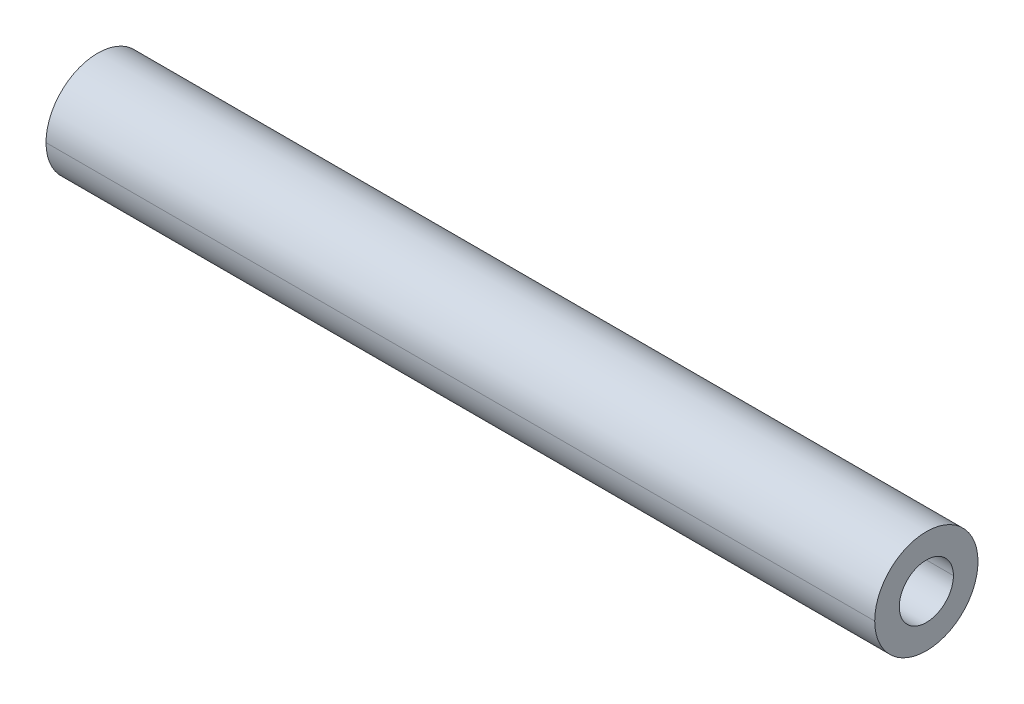
ISO-10303-21;
HEADER;
FILE_DESCRIPTION(('STEP AP214'),'2;1');
FILE_NAME('part.step','',(''),(''),'','','');
FILE_SCHEMA(('AUTOMOTIVE_DESIGN { 1 0 10303 214 1 1 1 1 }'));
ENDSEC;
DATA;
#1=APPLICATION_CONTEXT('core data for automotive mechanical design processes');
#2=APPLICATION_PROTOCOL_DEFINITION('international standard','automotive_design',2000,#1);
#3=PRODUCT_CONTEXT('',#1,'mechanical');
#4=PRODUCT('Part','Part','',(#3));
#5=PRODUCT_RELATED_PRODUCT_CATEGORY('part','',(#4));
#6=PRODUCT_DEFINITION_FORMATION('','',#4);
#7=PRODUCT_DEFINITION_CONTEXT('part definition',#1,'design');
#8=PRODUCT_DEFINITION('design','',#6,#7);
#9=PRODUCT_DEFINITION_SHAPE('','',#8);
#10=(LENGTH_UNIT() NAMED_UNIT(*) SI_UNIT(.MILLI.,.METRE.));
#11=(NAMED_UNIT(*) PLANE_ANGLE_UNIT() SI_UNIT($,.RADIAN.));
#12=(NAMED_UNIT(*) SI_UNIT($,.STERADIAN.) SOLID_ANGLE_UNIT());
#13=UNCERTAINTY_MEASURE_WITH_UNIT(LENGTH_MEASURE(1.E-05),#10,'distance_accuracy_value','');
#14=(GEOMETRIC_REPRESENTATION_CONTEXT(3) GLOBAL_UNCERTAINTY_ASSIGNED_CONTEXT((#13)) GLOBAL_UNIT_ASSIGNED_CONTEXT((#10,
#11,#12)) REPRESENTATION_CONTEXT('',''));
#15=CARTESIAN_POINT('',(0.,0.,0.));
#16=DIRECTION('',(0.,0.,1.));
#17=DIRECTION('',(1.,0.,0.));
#18=AXIS2_PLACEMENT_3D('',#15,#16,#17);
#19=CARTESIAN_POINT('',(38.1,0.,0.));
#20=DIRECTION('',(-1.,0.,0.));
#21=DIRECTION('',(0.,0.,1.));
#22=AXIS2_PLACEMENT_3D('',#19,#20,#21);
#23=CYLINDRICAL_SURFACE('',#22,2.4892);
#24=DIRECTION('',(-1.,0.,0.));
#25=VECTOR('',#24,1.);
#26=CARTESIAN_POINT('',(38.1,0.,-2.4892));
#27=LINE('',#26,#25);
#28=CARTESIAN_POINT('',(38.1,0.,-2.4892));
#29=VERTEX_POINT('',#28);
#30=CARTESIAN_POINT('',(-38.1,0.,-2.4892));
#31=VERTEX_POINT('',#30);
#32=EDGE_CURVE('E85',#29,#31,#27,.T.);
#33=ORIENTED_EDGE('',*,*,#32,.F.);
#34=CARTESIAN_POINT('',(38.1,0.,0.));
#35=DIRECTION('',(1.,0.,0.));
#36=DIRECTION('',(0.,0.,-1.));
#37=AXIS2_PLACEMENT_3D('',#34,#35,#36);
#38=CIRCLE('',#37,2.4892);
#39=CARTESIAN_POINT('',(38.1,0.,2.4892));
#40=VERTEX_POINT('',#39);
#41=EDGE_CURVE('E76',#29,#40,#38,.T.);
#42=ORIENTED_EDGE('',*,*,#41,.T.);
#43=DIRECTION('',(-1.,0.,0.));
#44=VECTOR('',#43,1.);
#45=CARTESIAN_POINT('',(38.1,0.,2.4892));
#46=LINE('',#45,#44);
#47=CARTESIAN_POINT('',(-38.1,0.,2.4892));
#48=VERTEX_POINT('',#47);
#49=EDGE_CURVE('E82',#40,#48,#46,.T.);
#50=ORIENTED_EDGE('',*,*,#49,.T.);
#51=CARTESIAN_POINT('',(-38.1,0.,0.));
#52=DIRECTION('',(1.,0.,0.));
#53=DIRECTION('',(0.,0.,-1.));
#54=AXIS2_PLACEMENT_3D('',#51,#52,#53);
#55=CIRCLE('',#54,2.4892);
#56=EDGE_CURVE('E11',#31,#48,#55,.T.);
#57=ORIENTED_EDGE('',*,*,#56,.F.);
#58=EDGE_LOOP('',(#33,#42,#50,#57));
#59=FACE_BOUND('',#58,.T.);
#60=ADVANCED_FACE('F17',(#59),#23,.F.);
#61=CARTESIAN_POINT('',(38.1,0.,0.));
#62=DIRECTION('',(-1.,0.,0.));
#63=DIRECTION('',(0.,0.,1.));
#64=AXIS2_PLACEMENT_3D('',#61,#62,#63);
#65=CYLINDRICAL_SURFACE('',#64,4.7498);
#66=DIRECTION('',(-1.,0.,0.));
#67=VECTOR('',#66,1.);
#68=CARTESIAN_POINT('',(38.1,0.,-4.7498));
#69=LINE('',#68,#67);
#70=CARTESIAN_POINT('',(38.1,0.,-4.7498));
#71=VERTEX_POINT('',#70);
#72=CARTESIAN_POINT('',(-38.1,0.,-4.7498));
#73=VERTEX_POINT('',#72);
#74=EDGE_CURVE('E104',#71,#73,#69,.T.);
#75=ORIENTED_EDGE('',*,*,#74,.F.);
#76=CARTESIAN_POINT('',(38.1,0.,0.));
#77=DIRECTION('',(1.,0.,0.));
#78=DIRECTION('',(0.,0.,-1.));
#79=AXIS2_PLACEMENT_3D('',#76,#77,#78);
#80=CIRCLE('',#79,4.7498);
#81=CARTESIAN_POINT('',(38.1,0.,4.7498));
#82=VERTEX_POINT('',#81);
#83=EDGE_CURVE('E55',#82,#71,#80,.T.);
#84=ORIENTED_EDGE('',*,*,#83,.F.);
#85=DIRECTION('',(-1.,0.,0.));
#86=VECTOR('',#85,1.);
#87=CARTESIAN_POINT('',(38.1,0.,4.7498));
#88=LINE('',#87,#86);
#89=CARTESIAN_POINT('',(-38.1,0.,4.7498));
#90=VERTEX_POINT('',#89);
#91=EDGE_CURVE('E115',#82,#90,#88,.T.);
#92=ORIENTED_EDGE('',*,*,#91,.T.);
#93=CARTESIAN_POINT('',(-38.1,0.,0.));
#94=DIRECTION('',(1.,0.,0.));
#95=DIRECTION('',(0.,0.,-1.));
#96=AXIS2_PLACEMENT_3D('',#93,#94,#95);
#97=CIRCLE('',#96,4.7498);
#98=EDGE_CURVE('E27',#90,#73,#97,.T.);
#99=ORIENTED_EDGE('',*,*,#98,.T.);
#100=EDGE_LOOP('',(#75,#84,#92,#99));
#101=FACE_BOUND('',#100,.T.);
#102=ADVANCED_FACE('F191',(#101),#65,.T.);
#103=CARTESIAN_POINT('',(-38.1,0.,0.));
#104=DIRECTION('',(1.,0.,0.));
#105=DIRECTION('',(0.,1.,0.));
#106=AXIS2_PLACEMENT_3D('',#103,#104,#105);
#107=PLANE('',#106);
#108=CARTESIAN_POINT('',(-38.1,0.,0.));
#109=DIRECTION('',(1.,0.,0.));
#110=DIRECTION('',(0.,0.,-1.));
#111=AXIS2_PLACEMENT_3D('',#108,#109,#110);
#112=CIRCLE('',#111,2.4892);
#113=EDGE_CURVE('E20',#48,#31,#112,.T.);
#114=ORIENTED_EDGE('',*,*,#113,.T.);
#115=ORIENTED_EDGE('',*,*,#56,.T.);
#116=EDGE_LOOP('',(#114,#115));
#117=FACE_BOUND('',#116,.T.);
#118=ORIENTED_EDGE('',*,*,#98,.F.);
#119=CARTESIAN_POINT('',(-38.1,0.,0.));
#120=DIRECTION('',(1.,0.,0.));
#121=DIRECTION('',(0.,0.,-1.));
#122=AXIS2_PLACEMENT_3D('',#119,#120,#121);
#123=CIRCLE('',#122,4.7498);
#124=EDGE_CURVE('E108',#73,#90,#123,.T.);
#125=ORIENTED_EDGE('',*,*,#124,.F.);
#126=EDGE_LOOP('',(#118,#125));
#127=FACE_BOUND('',#126,.T.);
#128=ADVANCED_FACE('F195',(#117,#127),#107,.F.);
#129=CARTESIAN_POINT('',(38.1,0.,0.));
#130=DIRECTION('',(1.,0.,0.));
#131=DIRECTION('',(0.,1.,0.));
#132=AXIS2_PLACEMENT_3D('',#129,#130,#131);
#133=PLANE('',#132);
#134=CARTESIAN_POINT('',(38.1,0.,0.));
#135=DIRECTION('',(1.,0.,0.));
#136=DIRECTION('',(0.,0.,-1.));
#137=AXIS2_PLACEMENT_3D('',#134,#135,#136);
#138=CIRCLE('',#137,2.4892);
#139=EDGE_CURVE('E91',#40,#29,#138,.T.);
#140=ORIENTED_EDGE('',*,*,#139,.F.);
#141=ORIENTED_EDGE('',*,*,#41,.F.);
#142=EDGE_LOOP('',(#140,#141));
#143=FACE_BOUND('',#142,.T.);
#144=ORIENTED_EDGE('',*,*,#83,.T.);
#145=CARTESIAN_POINT('',(38.1,0.,0.));
#146=DIRECTION('',(1.,0.,0.));
#147=DIRECTION('',(0.,0.,-1.));
#148=AXIS2_PLACEMENT_3D('',#145,#146,#147);
#149=CIRCLE('',#148,4.7498);
#150=EDGE_CURVE('E93',#71,#82,#149,.T.);
#151=ORIENTED_EDGE('',*,*,#150,.T.);
#152=EDGE_LOOP('',(#144,#151));
#153=FACE_BOUND('',#152,.T.);
#154=ADVANCED_FACE('F95',(#143,#153),#133,.T.);
#155=CARTESIAN_POINT('',(38.1,0.,0.));
#156=DIRECTION('',(-1.,0.,0.));
#157=DIRECTION('',(0.,0.,1.));
#158=AXIS2_PLACEMENT_3D('',#155,#156,#157);
#159=CYLINDRICAL_SURFACE('',#158,4.7498);
#160=ORIENTED_EDGE('',*,*,#150,.F.);
#161=ORIENTED_EDGE('',*,*,#74,.T.);
#162=ORIENTED_EDGE('',*,*,#124,.T.);
#163=ORIENTED_EDGE('',*,*,#91,.F.);
#164=EDGE_LOOP('',(#160,#161,#162,#163));
#165=FACE_BOUND('',#164,.T.);
#166=ADVANCED_FACE('F178',(#165),#159,.T.);
#167=CARTESIAN_POINT('',(38.1,0.,0.));
#168=DIRECTION('',(-1.,0.,0.));
#169=DIRECTION('',(0.,0.,1.));
#170=AXIS2_PLACEMENT_3D('',#167,#168,#169);
#171=CYLINDRICAL_SURFACE('',#170,2.4892);
#172=ORIENTED_EDGE('',*,*,#139,.T.);
#173=ORIENTED_EDGE('',*,*,#32,.T.);
#174=ORIENTED_EDGE('',*,*,#113,.F.);
#175=ORIENTED_EDGE('',*,*,#49,.F.);
#176=EDGE_LOOP('',(#172,#173,#174,#175));
#177=FACE_BOUND('',#176,.T.);
#178=ADVANCED_FACE('F90',(#177),#171,.F.);
#179=CLOSED_SHELL('',(#60,#102,#128,#154,#166,#178));
#180=MANIFOLD_SOLID_BREP('B1',#179);
#181=ADVANCED_BREP_SHAPE_REPRESENTATION('',(#18,#180),#14);
#182=SHAPE_DEFINITION_REPRESENTATION(#9,#181);
ENDSEC;
END-ISO-10303-21;
